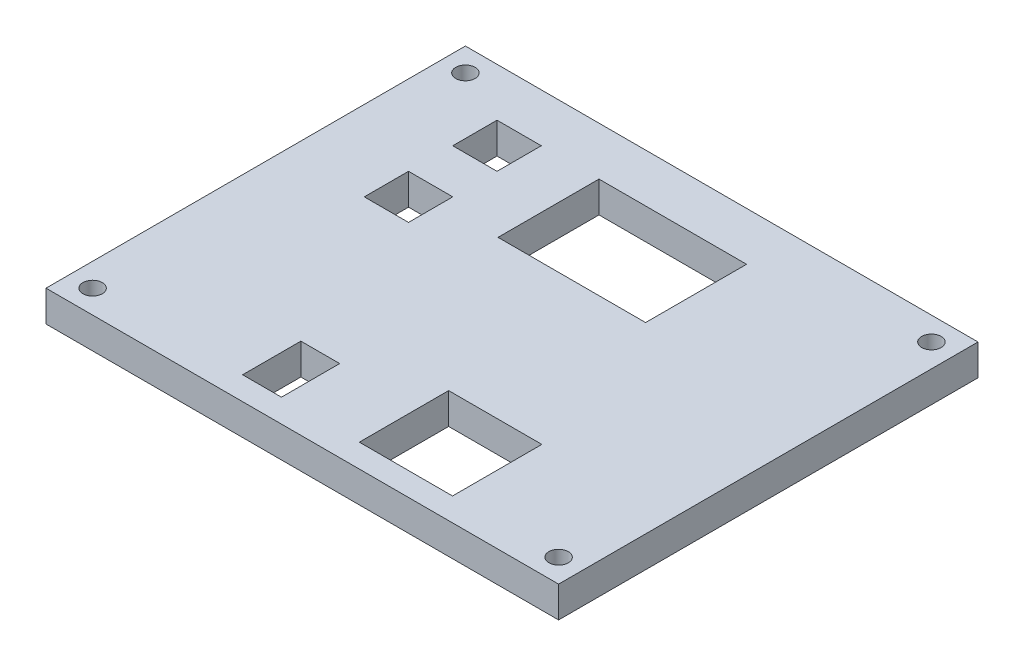
ISO-10303-21;
HEADER;
FILE_DESCRIPTION(('STEP AP214'),'2;1');
FILE_NAME('part.step','',(''),(''),'','','');
FILE_SCHEMA(('AUTOMOTIVE_DESIGN { 1 0 10303 214 1 1 1 1 }'));
ENDSEC;
DATA;
#1=APPLICATION_CONTEXT('core data for automotive mechanical design processes');
#2=APPLICATION_PROTOCOL_DEFINITION('international standard','automotive_design',2000,#1);
#3=PRODUCT_CONTEXT('',#1,'mechanical');
#4=PRODUCT('Part','Part','',(#3));
#5=PRODUCT_RELATED_PRODUCT_CATEGORY('part','',(#4));
#6=PRODUCT_DEFINITION_FORMATION('','',#4);
#7=PRODUCT_DEFINITION_CONTEXT('part definition',#1,'design');
#8=PRODUCT_DEFINITION('design','',#6,#7);
#9=PRODUCT_DEFINITION_SHAPE('','',#8);
#10=(LENGTH_UNIT() NAMED_UNIT(*) SI_UNIT(.MILLI.,.METRE.));
#11=(NAMED_UNIT(*) PLANE_ANGLE_UNIT() SI_UNIT($,.RADIAN.));
#12=(NAMED_UNIT(*) SI_UNIT($,.STERADIAN.) SOLID_ANGLE_UNIT());
#13=UNCERTAINTY_MEASURE_WITH_UNIT(LENGTH_MEASURE(1.E-05),#10,'distance_accuracy_value','');
#14=(GEOMETRIC_REPRESENTATION_CONTEXT(3) GLOBAL_UNCERTAINTY_ASSIGNED_CONTEXT((#13)) GLOBAL_UNIT_ASSIGNED_CONTEXT((#10,
#11,#12)) REPRESENTATION_CONTEXT('',''));
#15=CARTESIAN_POINT('',(0.,0.,0.));
#16=DIRECTION('',(0.,0.,1.));
#17=DIRECTION('',(1.,0.,0.));
#18=AXIS2_PLACEMENT_3D('',#15,#16,#17);
#19=CARTESIAN_POINT('',(0.,4.,0.));
#20=DIRECTION('',(1.,0.,0.));
#21=DIRECTION('',(0.,0.,-1.));
#22=AXIS2_PLACEMENT_3D('',#19,#20,#21);
#23=PLANE('',#22);
#24=DIRECTION('',(0.,0.,1.));
#25=VECTOR('',#24,1.);
#26=CARTESIAN_POINT('',(0.,0.,0.));
#27=LINE('',#26,#25);
#28=CARTESIAN_POINT('',(0.,0.,0.));
#29=VERTEX_POINT('',#28);
#30=CARTESIAN_POINT('',(0.,0.,54.));
#31=VERTEX_POINT('',#30);
#32=EDGE_CURVE('E462',#29,#31,#27,.T.);
#33=ORIENTED_EDGE('',*,*,#32,.T.);
#34=DIRECTION('',(0.,-1.,0.));
#35=VECTOR('',#34,1.);
#36=CARTESIAN_POINT('',(0.,4.,54.));
#37=LINE('',#36,#35);
#38=CARTESIAN_POINT('',(0.,4.,54.));
#39=VERTEX_POINT('',#38);
#40=EDGE_CURVE('E11',#39,#31,#37,.T.);
#41=ORIENTED_EDGE('',*,*,#40,.F.);
#42=DIRECTION('',(0.,0.,1.));
#43=VECTOR('',#42,1.);
#44=CARTESIAN_POINT('',(0.,4.,0.));
#45=LINE('',#44,#43);
#46=CARTESIAN_POINT('',(0.,4.,0.));
#47=VERTEX_POINT('',#46);
#48=EDGE_CURVE('E463',#47,#39,#45,.T.);
#49=ORIENTED_EDGE('',*,*,#48,.F.);
#50=DIRECTION('',(0.,-1.,0.));
#51=VECTOR('',#50,1.);
#52=CARTESIAN_POINT('',(0.,4.,0.));
#53=LINE('',#52,#51);
#54=EDGE_CURVE('E479',#47,#29,#53,.T.);
#55=ORIENTED_EDGE('',*,*,#54,.T.);
#56=EDGE_LOOP('',(#33,#41,#49,#55));
#57=FACE_BOUND('',#56,.T.);
#58=ADVANCED_FACE('F42',(#57),#23,.F.);
#59=CARTESIAN_POINT('',(0.,4.,54.));
#60=DIRECTION('',(0.,0.,-1.));
#61=DIRECTION('',(-1.,0.,0.));
#62=AXIS2_PLACEMENT_3D('',#59,#60,#61);
#63=PLANE('',#62);
#64=DIRECTION('',(1.,0.,0.));
#65=VECTOR('',#64,1.);
#66=CARTESIAN_POINT('',(0.,0.,54.));
#67=LINE('',#66,#65);
#68=CARTESIAN_POINT('',(66.,0.,54.));
#69=VERTEX_POINT('',#68);
#70=EDGE_CURVE('E483',#31,#69,#67,.T.);
#71=ORIENTED_EDGE('',*,*,#70,.T.);
#72=DIRECTION('',(0.,-1.,0.));
#73=VECTOR('',#72,1.);
#74=CARTESIAN_POINT('',(66.,4.,54.));
#75=LINE('',#74,#73);
#76=CARTESIAN_POINT('',(66.,4.,54.));
#77=VERTEX_POINT('',#76);
#78=EDGE_CURVE('E50',#77,#69,#75,.T.);
#79=ORIENTED_EDGE('',*,*,#78,.F.);
#80=DIRECTION('',(1.,0.,0.));
#81=VECTOR('',#80,1.);
#82=CARTESIAN_POINT('',(0.,4.,54.));
#83=LINE('',#82,#81);
#84=EDGE_CURVE('E467',#39,#77,#83,.T.);
#85=ORIENTED_EDGE('',*,*,#84,.F.);
#86=ORIENTED_EDGE('',*,*,#40,.T.);
#87=EDGE_LOOP('',(#71,#79,#85,#86));
#88=FACE_BOUND('',#87,.T.);
#89=ADVANCED_FACE('F505',(#88),#63,.F.);
#90=CARTESIAN_POINT('',(66.,4.,0.));
#91=DIRECTION('',(1.,0.,0.));
#92=DIRECTION('',(0.,0.,-1.));
#93=AXIS2_PLACEMENT_3D('',#90,#91,#92);
#94=PLANE('',#93);
#95=DIRECTION('',(0.,0.,1.));
#96=VECTOR('',#95,1.);
#97=CARTESIAN_POINT('',(66.,0.,0.));
#98=LINE('',#97,#96);
#99=CARTESIAN_POINT('',(66.,0.,0.));
#100=VERTEX_POINT('',#99);
#101=EDGE_CURVE('E487',#100,#69,#98,.T.);
#102=ORIENTED_EDGE('',*,*,#101,.F.);
#103=DIRECTION('',(0.,-1.,0.));
#104=VECTOR('',#103,1.);
#105=CARTESIAN_POINT('',(66.,4.,0.));
#106=LINE('',#105,#104);
#107=CARTESIAN_POINT('',(66.,4.,0.));
#108=VERTEX_POINT('',#107);
#109=EDGE_CURVE('E496',#108,#100,#106,.T.);
#110=ORIENTED_EDGE('',*,*,#109,.F.);
#111=DIRECTION('',(0.,0.,1.));
#112=VECTOR('',#111,1.);
#113=CARTESIAN_POINT('',(66.,4.,0.));
#114=LINE('',#113,#112);
#115=EDGE_CURVE('E471',#108,#77,#114,.T.);
#116=ORIENTED_EDGE('',*,*,#115,.T.);
#117=ORIENTED_EDGE('',*,*,#78,.T.);
#118=EDGE_LOOP('',(#102,#110,#116,#117));
#119=FACE_BOUND('',#118,.T.);
#120=ADVANCED_FACE('F502',(#119),#94,.T.);
#121=CARTESIAN_POINT('',(0.,4.,0.));
#122=DIRECTION('',(0.,0.,-1.));
#123=DIRECTION('',(-1.,0.,0.));
#124=AXIS2_PLACEMENT_3D('',#121,#122,#123);
#125=PLANE('',#124);
#126=DIRECTION('',(1.,0.,0.));
#127=VECTOR('',#126,1.);
#128=CARTESIAN_POINT('',(0.,0.,0.));
#129=LINE('',#128,#127);
#130=EDGE_CURVE('E468',#29,#100,#129,.T.);
#131=ORIENTED_EDGE('',*,*,#130,.F.);
#132=ORIENTED_EDGE('',*,*,#54,.F.);
#133=DIRECTION('',(1.,0.,0.));
#134=VECTOR('',#133,1.);
#135=CARTESIAN_POINT('',(0.,4.,0.));
#136=LINE('',#135,#134);
#137=EDGE_CURVE('E475',#47,#108,#136,.T.);
#138=ORIENTED_EDGE('',*,*,#137,.T.);
#139=ORIENTED_EDGE('',*,*,#109,.T.);
#140=EDGE_LOOP('',(#131,#132,#138,#139));
#141=FACE_BOUND('',#140,.T.);
#142=ADVANCED_FACE('F511',(#141),#125,.T.);
#143=CARTESIAN_POINT('',(0.,4.,0.));
#144=DIRECTION('',(0.,1.,0.));
#145=DIRECTION('',(0.,0.,1.));
#146=AXIS2_PLACEMENT_3D('',#143,#144,#145);
#147=PLANE('',#146);
#148=DIRECTION('',(0.,0.,1.));
#149=VECTOR('',#148,1.);
#150=CARTESIAN_POINT('',(37.3428467723542,4.,39.5));
#151=LINE('',#150,#149);
#152=CARTESIAN_POINT('',(37.3428467723542,4.,39.5));
#153=VERTEX_POINT('',#152);
#154=CARTESIAN_POINT('',(37.3428467723542,4.,51.));
#155=VERTEX_POINT('',#154);
#156=EDGE_CURVE('E57',#153,#155,#151,.T.);
#157=ORIENTED_EDGE('',*,*,#156,.F.);
#158=DIRECTION('',(-1.,0.,0.));
#159=VECTOR('',#158,1.);
#160=CARTESIAN_POINT('',(37.3428467723542,4.,39.5));
#161=LINE('',#160,#159);
#162=CARTESIAN_POINT('',(49.3428467723542,4.,39.5));
#163=VERTEX_POINT('',#162);
#164=EDGE_CURVE('E351',#163,#153,#161,.T.);
#165=ORIENTED_EDGE('',*,*,#164,.F.);
#166=DIRECTION('',(0.,0.,-1.));
#167=VECTOR('',#166,1.);
#168=CARTESIAN_POINT('',(49.3428467723542,4.,39.5));
#169=LINE('',#168,#167);
#170=CARTESIAN_POINT('',(49.3428467723542,4.,51.));
#171=VERTEX_POINT('',#170);
#172=EDGE_CURVE('E370',#171,#163,#169,.T.);
#173=ORIENTED_EDGE('',*,*,#172,.F.);
#174=DIRECTION('',(1.,0.,0.));
#175=VECTOR('',#174,1.);
#176=CARTESIAN_POINT('',(37.3428467723542,4.,51.));
#177=LINE('',#176,#175);
#178=EDGE_CURVE('E366',#155,#171,#177,.T.);
#179=ORIENTED_EDGE('',*,*,#178,.F.);
#180=EDGE_LOOP('',(#157,#165,#173,#179));
#181=FACE_BOUND('',#180,.T.);
#182=DIRECTION('',(0.,0.,1.));
#183=VECTOR('',#182,1.);
#184=CARTESIAN_POINT('',(23.4359550561798,4.,6.23462530139378));
#185=LINE('',#184,#183);
#186=CARTESIAN_POINT('',(23.4359550561798,4.,6.23462530139378));
#187=VERTEX_POINT('',#186);
#188=CARTESIAN_POINT('',(23.4359550561798,4.,19.2346253013938));
#189=VERTEX_POINT('',#188);
#190=EDGE_CURVE('E65',#187,#189,#185,.T.);
#191=ORIENTED_EDGE('',*,*,#190,.F.);
#192=DIRECTION('',(-1.,0.,0.));
#193=VECTOR('',#192,1.);
#194=CARTESIAN_POINT('',(23.4359550561798,4.,6.23462530139378));
#195=LINE('',#194,#193);
#196=CARTESIAN_POINT('',(42.4359550561798,4.,6.23462530139378));
#197=VERTEX_POINT('',#196);
#198=EDGE_CURVE('E309',#197,#187,#195,.T.);
#199=ORIENTED_EDGE('',*,*,#198,.F.);
#200=DIRECTION('',(0.,0.,-1.));
#201=VECTOR('',#200,1.);
#202=CARTESIAN_POINT('',(42.4359550561798,4.,6.23462530139378));
#203=LINE('',#202,#201);
#204=CARTESIAN_POINT('',(42.4359550561798,4.,19.2346253013938));
#205=VERTEX_POINT('',#204);
#206=EDGE_CURVE('E329',#205,#197,#203,.T.);
#207=ORIENTED_EDGE('',*,*,#206,.F.);
#208=DIRECTION('',(1.,0.,0.));
#209=VECTOR('',#208,1.);
#210=CARTESIAN_POINT('',(23.4359550561798,4.,19.2346253013938));
#211=LINE('',#210,#209);
#212=EDGE_CURVE('E324',#189,#205,#211,.T.);
#213=ORIENTED_EDGE('',*,*,#212,.F.);
#214=EDGE_LOOP('',(#191,#199,#207,#213));
#215=FACE_BOUND('',#214,.T.);
#216=DIRECTION('',(0.,0.,1.));
#217=VECTOR('',#216,1.);
#218=CARTESIAN_POINT('',(10.3072222462533,4.,6.23462530139378));
#219=LINE('',#218,#217);
#220=CARTESIAN_POINT('',(10.3072222462533,4.,6.23462530139378));
#221=VERTEX_POINT('',#220);
#222=CARTESIAN_POINT('',(10.3072222462533,4.,11.9346253013938));
#223=VERTEX_POINT('',#222);
#224=EDGE_CURVE('E278',#221,#223,#219,.T.);
#225=ORIENTED_EDGE('',*,*,#224,.F.);
#226=DIRECTION('',(-1.,0.,0.));
#227=VECTOR('',#226,1.);
#228=CARTESIAN_POINT('',(10.3072222462533,4.,6.23462530139378));
#229=LINE('',#228,#227);
#230=CARTESIAN_POINT('',(16.0072222462533,4.,6.23462530139378));
#231=VERTEX_POINT('',#230);
#232=EDGE_CURVE('E265',#231,#221,#229,.T.);
#233=ORIENTED_EDGE('',*,*,#232,.F.);
#234=DIRECTION('',(0.,0.,-1.));
#235=VECTOR('',#234,1.);
#236=CARTESIAN_POINT('',(16.0072222462533,4.,6.23462530139378));
#237=LINE('',#236,#235);
#238=CARTESIAN_POINT('',(16.0072222462533,4.,11.9346253013938));
#239=VERTEX_POINT('',#238);
#240=EDGE_CURVE('E286',#239,#231,#237,.T.);
#241=ORIENTED_EDGE('',*,*,#240,.F.);
#242=DIRECTION('',(1.,0.,0.));
#243=VECTOR('',#242,1.);
#244=CARTESIAN_POINT('',(10.3072222462533,4.,11.9346253013938));
#245=LINE('',#244,#243);
#246=EDGE_CURVE('E281',#223,#239,#245,.T.);
#247=ORIENTED_EDGE('',*,*,#246,.F.);
#248=EDGE_LOOP('',(#225,#233,#241,#247));
#249=FACE_BOUND('',#248,.T.);
#250=DIRECTION('',(0.,0.,1.));
#251=VECTOR('',#250,1.);
#252=CARTESIAN_POINT('',(10.3072222462533,4.,17.6307104987617));
#253=LINE('',#252,#251);
#254=CARTESIAN_POINT('',(10.3072222462533,4.,17.6307104987617));
#255=VERTEX_POINT('',#254);
#256=CARTESIAN_POINT('',(10.3072222462533,4.,23.3307104987617));
#257=VERTEX_POINT('',#256);
#258=EDGE_CURVE('E210',#255,#257,#253,.T.);
#259=ORIENTED_EDGE('',*,*,#258,.F.);
#260=DIRECTION('',(-1.,0.,0.));
#261=VECTOR('',#260,1.);
#262=CARTESIAN_POINT('',(10.3072222462533,4.,17.6307104987617));
#263=LINE('',#262,#261);
#264=CARTESIAN_POINT('',(16.0072222462531,4.,17.6307104987617));
#265=VERTEX_POINT('',#264);
#266=EDGE_CURVE('E231',#265,#255,#263,.T.);
#267=ORIENTED_EDGE('',*,*,#266,.F.);
#268=DIRECTION('',(0.,0.,-1.));
#269=VECTOR('',#268,1.);
#270=CARTESIAN_POINT('',(16.0072222462531,4.,17.6307104987617));
#271=LINE('',#270,#269);
#272=CARTESIAN_POINT('',(16.0072222462531,4.,23.3307104987617));
#273=VERTEX_POINT('',#272);
#274=EDGE_CURVE('E235',#273,#265,#271,.T.);
#275=ORIENTED_EDGE('',*,*,#274,.F.);
#276=DIRECTION('',(1.,0.,0.));
#277=VECTOR('',#276,1.);
#278=CARTESIAN_POINT('',(10.3072222462533,4.,23.3307104987617));
#279=LINE('',#278,#277);
#280=EDGE_CURVE('E244',#257,#273,#279,.T.);
#281=ORIENTED_EDGE('',*,*,#280,.F.);
#282=EDGE_LOOP('',(#259,#267,#275,#281));
#283=FACE_BOUND('',#282,.T.);
#284=DIRECTION('',(0.,0.,1.));
#285=VECTOR('',#284,1.);
#286=CARTESIAN_POINT('',(22.3150806727713,4.,43.5));
#287=LINE('',#286,#285);
#288=CARTESIAN_POINT('',(22.3150806727713,4.,43.5));
#289=VERTEX_POINT('',#288);
#290=CARTESIAN_POINT('',(22.3150806727713,4.,51.));
#291=VERTEX_POINT('',#290);
#292=EDGE_CURVE('E254',#289,#291,#287,.T.);
#293=ORIENTED_EDGE('',*,*,#292,.F.);
#294=DIRECTION('',(-1.,0.,0.));
#295=VECTOR('',#294,1.);
#296=CARTESIAN_POINT('',(22.3150806727713,4.,43.5));
#297=LINE('',#296,#295);
#298=CARTESIAN_POINT('',(27.3150806727713,4.,43.5));
#299=VERTEX_POINT('',#298);
#300=EDGE_CURVE('E392',#299,#289,#297,.T.);
#301=ORIENTED_EDGE('',*,*,#300,.F.);
#302=DIRECTION('',(0.,0.,-1.));
#303=VECTOR('',#302,1.);
#304=CARTESIAN_POINT('',(27.3150806727713,4.,43.5));
#305=LINE('',#304,#303);
#306=CARTESIAN_POINT('',(27.3150806727713,4.,51.));
#307=VERTEX_POINT('',#306);
#308=EDGE_CURVE('E411',#307,#299,#305,.T.);
#309=ORIENTED_EDGE('',*,*,#308,.F.);
#310=DIRECTION('',(1.,0.,0.));
#311=VECTOR('',#310,1.);
#312=CARTESIAN_POINT('',(22.3150806727713,4.,51.));
#313=LINE('',#312,#311);
#314=EDGE_CURVE('E407',#291,#307,#313,.T.);
#315=ORIENTED_EDGE('',*,*,#314,.F.);
#316=EDGE_LOOP('',(#293,#301,#309,#315));
#317=FACE_BOUND('',#316,.T.);
#318=CARTESIAN_POINT('',(3.00000000000001,4.,3.));
#319=DIRECTION('',(0.,1.,0.));
#320=DIRECTION('',(0.,0.,1.));
#321=AXIS2_PLACEMENT_3D('',#318,#319,#320);
#322=CIRCLE('',#321,1.24999999999999);
#323=CARTESIAN_POINT('',(3.00000000000001,4.,4.24999999999999));
#324=VERTEX_POINT('',#323);
#325=EDGE_CURVE('E421',#324,#324,#322,.T.);
#326=ORIENTED_EDGE('',*,*,#325,.F.);
#327=EDGE_LOOP('',(#326));
#328=FACE_BOUND('',#327,.T.);
#329=CARTESIAN_POINT('',(3.00000000000001,4.,51.));
#330=DIRECTION('',(0.,1.,0.));
#331=DIRECTION('',(0.,0.,1.));
#332=AXIS2_PLACEMENT_3D('',#329,#330,#331);
#333=CIRCLE('',#332,1.24999999999999);
#334=CARTESIAN_POINT('',(3.00000000000001,4.,52.25));
#335=VERTEX_POINT('',#334);
#336=EDGE_CURVE('E438',#335,#335,#333,.T.);
#337=ORIENTED_EDGE('',*,*,#336,.F.);
#338=EDGE_LOOP('',(#337));
#339=FACE_BOUND('',#338,.T.);
#340=CARTESIAN_POINT('',(63.,4.,51.));
#341=DIRECTION('',(0.,1.,0.));
#342=DIRECTION('',(0.,0.,1.));
#343=AXIS2_PLACEMENT_3D('',#340,#341,#342);
#344=CIRCLE('',#343,1.24999999999999);
#345=CARTESIAN_POINT('',(63.,4.,52.25));
#346=VERTEX_POINT('',#345);
#347=EDGE_CURVE('E446',#346,#346,#344,.T.);
#348=ORIENTED_EDGE('',*,*,#347,.F.);
#349=EDGE_LOOP('',(#348));
#350=FACE_BOUND('',#349,.T.);
#351=CARTESIAN_POINT('',(63.,4.,3.));
#352=DIRECTION('',(0.,1.,0.));
#353=DIRECTION('',(0.,0.,1.));
#354=AXIS2_PLACEMENT_3D('',#351,#352,#353);
#355=CIRCLE('',#354,1.24999999999999);
#356=CARTESIAN_POINT('',(63.,4.,4.24999999999998));
#357=VERTEX_POINT('',#356);
#358=EDGE_CURVE('E454',#357,#357,#355,.T.);
#359=ORIENTED_EDGE('',*,*,#358,.F.);
#360=EDGE_LOOP('',(#359));
#361=FACE_BOUND('',#360,.T.);
#362=ORIENTED_EDGE('',*,*,#48,.T.);
#363=ORIENTED_EDGE('',*,*,#84,.T.);
#364=ORIENTED_EDGE('',*,*,#115,.F.);
#365=ORIENTED_EDGE('',*,*,#137,.F.);
#366=EDGE_LOOP('',(#362,#363,#364,#365));
#367=FACE_BOUND('',#366,.T.);
#368=ADVANCED_FACE('F515',(#181,#215,#249,#283,#317,#328,#339,#350,#361,#367),#147,.T.);
#369=CARTESIAN_POINT('',(0.,0.,0.));
#370=DIRECTION('',(0.,1.,0.));
#371=DIRECTION('',(0.,0.,1.));
#372=AXIS2_PLACEMENT_3D('',#369,#370,#371);
#373=PLANE('',#372);
#374=DIRECTION('',(-1.,0.,0.));
#375=VECTOR('',#374,1.);
#376=CARTESIAN_POINT('',(37.3428467723542,0.,39.5));
#377=LINE('',#376,#375);
#378=CARTESIAN_POINT('',(49.3428467723542,0.,39.5));
#379=VERTEX_POINT('',#378);
#380=CARTESIAN_POINT('',(37.3428467723542,0.,39.5));
#381=VERTEX_POINT('',#380);
#382=EDGE_CURVE('E359',#379,#381,#377,.T.);
#383=ORIENTED_EDGE('',*,*,#382,.T.);
#384=DIRECTION('',(0.,0.,1.));
#385=VECTOR('',#384,1.);
#386=CARTESIAN_POINT('',(37.3428467723542,0.,39.5));
#387=LINE('',#386,#385);
#388=CARTESIAN_POINT('',(37.3428467723542,0.,51.));
#389=VERTEX_POINT('',#388);
#390=EDGE_CURVE('E346',#381,#389,#387,.T.);
#391=ORIENTED_EDGE('',*,*,#390,.T.);
#392=DIRECTION('',(1.,0.,0.));
#393=VECTOR('',#392,1.);
#394=CARTESIAN_POINT('',(37.3428467723542,0.,51.));
#395=LINE('',#394,#393);
#396=CARTESIAN_POINT('',(49.3428467723542,0.,51.));
#397=VERTEX_POINT('',#396);
#398=EDGE_CURVE('E350',#389,#397,#395,.T.);
#399=ORIENTED_EDGE('',*,*,#398,.T.);
#400=DIRECTION('',(0.,0.,-1.));
#401=VECTOR('',#400,1.);
#402=CARTESIAN_POINT('',(49.3428467723542,0.,39.5));
#403=LINE('',#402,#401);
#404=EDGE_CURVE('E355',#397,#379,#403,.T.);
#405=ORIENTED_EDGE('',*,*,#404,.T.);
#406=EDGE_LOOP('',(#383,#391,#399,#405));
#407=FACE_BOUND('',#406,.T.);
#408=DIRECTION('',(-1.,0.,0.));
#409=VECTOR('',#408,1.);
#410=CARTESIAN_POINT('',(23.4359550561798,0.,6.23462530139378));
#411=LINE('',#410,#409);
#412=CARTESIAN_POINT('',(42.4359550561798,0.,6.23462530139378));
#413=VERTEX_POINT('',#412);
#414=CARTESIAN_POINT('',(23.4359550561798,0.,6.23462530139378));
#415=VERTEX_POINT('',#414);
#416=EDGE_CURVE('E317',#413,#415,#411,.T.);
#417=ORIENTED_EDGE('',*,*,#416,.T.);
#418=DIRECTION('',(0.,0.,1.));
#419=VECTOR('',#418,1.);
#420=CARTESIAN_POINT('',(23.4359550561798,0.,6.23462530139378));
#421=LINE('',#420,#419);
#422=CARTESIAN_POINT('',(23.4359550561798,0.,19.2346253013938));
#423=VERTEX_POINT('',#422);
#424=EDGE_CURVE('E304',#415,#423,#421,.T.);
#425=ORIENTED_EDGE('',*,*,#424,.T.);
#426=DIRECTION('',(1.,0.,0.));
#427=VECTOR('',#426,1.);
#428=CARTESIAN_POINT('',(23.4359550561798,0.,19.2346253013938));
#429=LINE('',#428,#427);
#430=CARTESIAN_POINT('',(42.4359550561798,0.,19.2346253013938));
#431=VERTEX_POINT('',#430);
#432=EDGE_CURVE('E308',#423,#431,#429,.T.);
#433=ORIENTED_EDGE('',*,*,#432,.T.);
#434=DIRECTION('',(0.,0.,-1.));
#435=VECTOR('',#434,1.);
#436=CARTESIAN_POINT('',(42.4359550561798,0.,6.23462530139378));
#437=LINE('',#436,#435);
#438=EDGE_CURVE('E313',#431,#413,#437,.T.);
#439=ORIENTED_EDGE('',*,*,#438,.T.);
#440=EDGE_LOOP('',(#417,#425,#433,#439));
#441=FACE_BOUND('',#440,.T.);
#442=DIRECTION('',(-1.,0.,0.));
#443=VECTOR('',#442,1.);
#444=CARTESIAN_POINT('',(10.3072222462533,0.,6.23462530139378));
#445=LINE('',#444,#443);
#446=CARTESIAN_POINT('',(16.0072222462533,0.,6.23462530139378));
#447=VERTEX_POINT('',#446);
#448=CARTESIAN_POINT('',(10.3072222462533,0.,6.23462530139378));
#449=VERTEX_POINT('',#448);
#450=EDGE_CURVE('E273',#447,#449,#445,.T.);
#451=ORIENTED_EDGE('',*,*,#450,.T.);
#452=DIRECTION('',(0.,0.,1.));
#453=VECTOR('',#452,1.);
#454=CARTESIAN_POINT('',(10.3072222462533,0.,6.23462530139378));
#455=LINE('',#454,#453);
#456=CARTESIAN_POINT('',(10.3072222462533,0.,11.9346253013938));
#457=VERTEX_POINT('',#456);
#458=EDGE_CURVE('E260',#449,#457,#455,.T.);
#459=ORIENTED_EDGE('',*,*,#458,.T.);
#460=DIRECTION('',(1.,0.,0.));
#461=VECTOR('',#460,1.);
#462=CARTESIAN_POINT('',(10.3072222462533,0.,11.9346253013938));
#463=LINE('',#462,#461);
#464=CARTESIAN_POINT('',(16.0072222462533,0.,11.9346253013938));
#465=VERTEX_POINT('',#464);
#466=EDGE_CURVE('E264',#457,#465,#463,.T.);
#467=ORIENTED_EDGE('',*,*,#466,.T.);
#468=DIRECTION('',(0.,0.,-1.));
#469=VECTOR('',#468,1.);
#470=CARTESIAN_POINT('',(16.0072222462533,0.,6.23462530139378));
#471=LINE('',#470,#469);
#472=EDGE_CURVE('E269',#465,#447,#471,.T.);
#473=ORIENTED_EDGE('',*,*,#472,.T.);
#474=EDGE_LOOP('',(#451,#459,#467,#473));
#475=FACE_BOUND('',#474,.T.);
#476=DIRECTION('',(-1.,0.,0.));
#477=VECTOR('',#476,1.);
#478=CARTESIAN_POINT('',(10.3072222462533,0.,17.6307104987617));
#479=LINE('',#478,#477);
#480=CARTESIAN_POINT('',(16.0072222462531,0.,17.6307104987617));
#481=VERTEX_POINT('',#480);
#482=CARTESIAN_POINT('',(10.3072222462533,0.,17.6307104987617));
#483=VERTEX_POINT('',#482);
#484=EDGE_CURVE('E216',#481,#483,#479,.T.);
#485=ORIENTED_EDGE('',*,*,#484,.T.);
#486=DIRECTION('',(0.,0.,1.));
#487=VECTOR('',#486,1.);
#488=CARTESIAN_POINT('',(10.3072222462533,0.,17.6307104987617));
#489=LINE('',#488,#487);
#490=CARTESIAN_POINT('',(10.3072222462533,0.,23.3307104987617));
#491=VERTEX_POINT('',#490);
#492=EDGE_CURVE('E207',#483,#491,#489,.T.);
#493=ORIENTED_EDGE('',*,*,#492,.T.);
#494=DIRECTION('',(1.,0.,0.));
#495=VECTOR('',#494,1.);
#496=CARTESIAN_POINT('',(10.3072222462533,0.,23.3307104987617));
#497=LINE('',#496,#495);
#498=CARTESIAN_POINT('',(16.0072222462531,0.,23.3307104987617));
#499=VERTEX_POINT('',#498);
#500=EDGE_CURVE('E220',#491,#499,#497,.T.);
#501=ORIENTED_EDGE('',*,*,#500,.T.);
#502=DIRECTION('',(0.,0.,-1.));
#503=VECTOR('',#502,1.);
#504=CARTESIAN_POINT('',(16.0072222462531,0.,17.6307104987617));
#505=LINE('',#504,#503);
#506=EDGE_CURVE('E225',#499,#481,#505,.T.);
#507=ORIENTED_EDGE('',*,*,#506,.T.);
#508=EDGE_LOOP('',(#485,#493,#501,#507));
#509=FACE_BOUND('',#508,.T.);
#510=DIRECTION('',(-1.,0.,0.));
#511=VECTOR('',#510,1.);
#512=CARTESIAN_POINT('',(22.3150806727713,0.,43.5));
#513=LINE('',#512,#511);
#514=CARTESIAN_POINT('',(27.3150806727713,0.,43.5));
#515=VERTEX_POINT('',#514);
#516=CARTESIAN_POINT('',(22.3150806727713,0.,43.5));
#517=VERTEX_POINT('',#516);
#518=EDGE_CURVE('E400',#515,#517,#513,.T.);
#519=ORIENTED_EDGE('',*,*,#518,.T.);
#520=DIRECTION('',(0.,0.,1.));
#521=VECTOR('',#520,1.);
#522=CARTESIAN_POINT('',(22.3150806727713,0.,43.5));
#523=LINE('',#522,#521);
#524=CARTESIAN_POINT('',(22.3150806727713,0.,51.));
#525=VERTEX_POINT('',#524);
#526=EDGE_CURVE('E387',#517,#525,#523,.T.);
#527=ORIENTED_EDGE('',*,*,#526,.T.);
#528=DIRECTION('',(1.,0.,0.));
#529=VECTOR('',#528,1.);
#530=CARTESIAN_POINT('',(22.3150806727713,0.,51.));
#531=LINE('',#530,#529);
#532=CARTESIAN_POINT('',(27.3150806727713,0.,51.));
#533=VERTEX_POINT('',#532);
#534=EDGE_CURVE('E391',#525,#533,#531,.T.);
#535=ORIENTED_EDGE('',*,*,#534,.T.);
#536=DIRECTION('',(0.,0.,-1.));
#537=VECTOR('',#536,1.);
#538=CARTESIAN_POINT('',(27.3150806727713,0.,43.5));
#539=LINE('',#538,#537);
#540=EDGE_CURVE('E396',#533,#515,#539,.T.);
#541=ORIENTED_EDGE('',*,*,#540,.T.);
#542=EDGE_LOOP('',(#519,#527,#535,#541));
#543=FACE_BOUND('',#542,.T.);
#544=CARTESIAN_POINT('',(3.00000000000001,0.,3.));
#545=DIRECTION('',(0.,1.,0.));
#546=DIRECTION('',(0.,0.,1.));
#547=AXIS2_PLACEMENT_3D('',#544,#545,#546);
#548=CIRCLE('',#547,1.24999999999999);
#549=CARTESIAN_POINT('',(3.00000000000001,0.,4.25));
#550=VERTEX_POINT('',#549);
#551=EDGE_CURVE('E434',#550,#550,#548,.T.);
#552=ORIENTED_EDGE('',*,*,#551,.T.);
#553=EDGE_LOOP('',(#552));
#554=FACE_BOUND('',#553,.T.);
#555=CARTESIAN_POINT('',(3.00000000000001,0.,51.));
#556=DIRECTION('',(0.,1.,0.));
#557=DIRECTION('',(0.,0.,1.));
#558=AXIS2_PLACEMENT_3D('',#555,#556,#557);
#559=CIRCLE('',#558,1.24999999999999);
#560=CARTESIAN_POINT('',(3.00000000000001,0.,52.25));
#561=VERTEX_POINT('',#560);
#562=EDGE_CURVE('E442',#561,#561,#559,.T.);
#563=ORIENTED_EDGE('',*,*,#562,.T.);
#564=EDGE_LOOP('',(#563));
#565=FACE_BOUND('',#564,.T.);
#566=CARTESIAN_POINT('',(63.,0.,51.));
#567=DIRECTION('',(0.,1.,0.));
#568=DIRECTION('',(0.,0.,1.));
#569=AXIS2_PLACEMENT_3D('',#566,#567,#568);
#570=CIRCLE('',#569,1.24999999999999);
#571=CARTESIAN_POINT('',(63.,0.,52.25));
#572=VERTEX_POINT('',#571);
#573=EDGE_CURVE('E450',#572,#572,#570,.T.);
#574=ORIENTED_EDGE('',*,*,#573,.T.);
#575=EDGE_LOOP('',(#574));
#576=FACE_BOUND('',#575,.T.);
#577=CARTESIAN_POINT('',(63.,0.,3.));
#578=DIRECTION('',(0.,1.,0.));
#579=DIRECTION('',(0.,0.,1.));
#580=AXIS2_PLACEMENT_3D('',#577,#578,#579);
#581=CIRCLE('',#580,1.24999999999999);
#582=CARTESIAN_POINT('',(63.,0.,4.24999999999999));
#583=VERTEX_POINT('',#582);
#584=EDGE_CURVE('E458',#583,#583,#581,.T.);
#585=ORIENTED_EDGE('',*,*,#584,.T.);
#586=EDGE_LOOP('',(#585));
#587=FACE_BOUND('',#586,.T.);
#588=ORIENTED_EDGE('',*,*,#32,.F.);
#589=ORIENTED_EDGE('',*,*,#130,.T.);
#590=ORIENTED_EDGE('',*,*,#101,.T.);
#591=ORIENTED_EDGE('',*,*,#70,.F.);
#592=EDGE_LOOP('',(#588,#589,#590,#591));
#593=FACE_BOUND('',#592,.T.);
#594=ADVANCED_FACE('F227',(#407,#441,#475,#509,#543,#554,#565,#576,#587,#593),#373,.F.);
#595=CARTESIAN_POINT('',(63.,4.,3.));
#596=DIRECTION('',(0.,1.,0.));
#597=DIRECTION('',(0.,0.,1.));
#598=AXIS2_PLACEMENT_3D('',#595,#596,#597);
#599=CYLINDRICAL_SURFACE('',#598,1.24999999999999);
#600=ORIENTED_EDGE('',*,*,#584,.F.);
#601=EDGE_LOOP('',(#600));
#602=FACE_BOUND('',#601,.T.);
#603=ORIENTED_EDGE('',*,*,#358,.T.);
#604=EDGE_LOOP('',(#603));
#605=FACE_BOUND('',#604,.T.);
#606=ADVANCED_FACE('F530',(#602,#605),#599,.F.);
#607=CARTESIAN_POINT('',(63.,4.,51.));
#608=DIRECTION('',(0.,1.,0.));
#609=DIRECTION('',(0.,0.,1.));
#610=AXIS2_PLACEMENT_3D('',#607,#608,#609);
#611=CYLINDRICAL_SURFACE('',#610,1.24999999999999);
#612=ORIENTED_EDGE('',*,*,#573,.F.);
#613=EDGE_LOOP('',(#612));
#614=FACE_BOUND('',#613,.T.);
#615=ORIENTED_EDGE('',*,*,#347,.T.);
#616=EDGE_LOOP('',(#615));
#617=FACE_BOUND('',#616,.T.);
#618=ADVANCED_FACE('F537',(#614,#617),#611,.F.);
#619=CARTESIAN_POINT('',(3.00000000000001,4.,51.));
#620=DIRECTION('',(0.,1.,0.));
#621=DIRECTION('',(0.,0.,1.));
#622=AXIS2_PLACEMENT_3D('',#619,#620,#621);
#623=CYLINDRICAL_SURFACE('',#622,1.24999999999999);
#624=ORIENTED_EDGE('',*,*,#562,.F.);
#625=EDGE_LOOP('',(#624));
#626=FACE_BOUND('',#625,.T.);
#627=ORIENTED_EDGE('',*,*,#336,.T.);
#628=EDGE_LOOP('',(#627));
#629=FACE_BOUND('',#628,.T.);
#630=ADVANCED_FACE('F541',(#626,#629),#623,.F.);
#631=CARTESIAN_POINT('',(3.00000000000001,4.,3.));
#632=DIRECTION('',(0.,1.,0.));
#633=DIRECTION('',(0.,0.,1.));
#634=AXIS2_PLACEMENT_3D('',#631,#632,#633);
#635=CYLINDRICAL_SURFACE('',#634,1.24999999999999);
#636=ORIENTED_EDGE('',*,*,#551,.F.);
#637=EDGE_LOOP('',(#636));
#638=FACE_BOUND('',#637,.T.);
#639=ORIENTED_EDGE('',*,*,#325,.T.);
#640=EDGE_LOOP('',(#639));
#641=FACE_BOUND('',#640,.T.);
#642=ADVANCED_FACE('F545',(#638,#641),#635,.F.);
#643=CARTESIAN_POINT('',(22.3150806727713,0.,43.5));
#644=DIRECTION('',(-1.,0.,0.));
#645=DIRECTION('',(0.,0.,1.));
#646=AXIS2_PLACEMENT_3D('',#643,#644,#645);
#647=PLANE('',#646);
#648=ORIENTED_EDGE('',*,*,#292,.T.);
#649=DIRECTION('',(0.,1.,0.));
#650=VECTOR('',#649,1.);
#651=CARTESIAN_POINT('',(22.3150806727713,0.,51.));
#652=LINE('',#651,#650);
#653=EDGE_CURVE('E404',#525,#291,#652,.T.);
#654=ORIENTED_EDGE('',*,*,#653,.F.);
#655=ORIENTED_EDGE('',*,*,#526,.F.);
#656=DIRECTION('',(0.,1.,0.));
#657=VECTOR('',#656,1.);
#658=CARTESIAN_POINT('',(22.3150806727713,0.,43.5));
#659=LINE('',#658,#657);
#660=EDGE_CURVE('E418',#517,#289,#659,.T.);
#661=ORIENTED_EDGE('',*,*,#660,.T.);
#662=EDGE_LOOP('',(#648,#654,#655,#661));
#663=FACE_BOUND('',#662,.T.);
#664=ADVANCED_FACE('F549',(#663),#647,.F.);
#665=CARTESIAN_POINT('',(22.3150806727713,0.,43.5));
#666=DIRECTION('',(0.,0.,-1.));
#667=DIRECTION('',(-1.,0.,0.));
#668=AXIS2_PLACEMENT_3D('',#665,#666,#667);
#669=PLANE('',#668);
#670=ORIENTED_EDGE('',*,*,#300,.T.);
#671=ORIENTED_EDGE('',*,*,#660,.F.);
#672=ORIENTED_EDGE('',*,*,#518,.F.);
#673=DIRECTION('',(0.,1.,0.));
#674=VECTOR('',#673,1.);
#675=CARTESIAN_POINT('',(27.3150806727713,0.,43.5));
#676=LINE('',#675,#674);
#677=EDGE_CURVE('E422',#515,#299,#676,.T.);
#678=ORIENTED_EDGE('',*,*,#677,.T.);
#679=EDGE_LOOP('',(#670,#671,#672,#678));
#680=FACE_BOUND('',#679,.T.);
#681=ADVANCED_FACE('F553',(#680),#669,.F.);
#682=CARTESIAN_POINT('',(27.3150806727713,0.,43.5));
#683=DIRECTION('',(1.,0.,0.));
#684=DIRECTION('',(0.,0.,-1.));
#685=AXIS2_PLACEMENT_3D('',#682,#683,#684);
#686=PLANE('',#685);
#687=ORIENTED_EDGE('',*,*,#308,.T.);
#688=ORIENTED_EDGE('',*,*,#677,.F.);
#689=ORIENTED_EDGE('',*,*,#540,.F.);
#690=DIRECTION('',(0.,1.,0.));
#691=VECTOR('',#690,1.);
#692=CARTESIAN_POINT('',(27.3150806727713,0.,51.));
#693=LINE('',#692,#691);
#694=EDGE_CURVE('E425',#533,#307,#693,.T.);
#695=ORIENTED_EDGE('',*,*,#694,.T.);
#696=EDGE_LOOP('',(#687,#688,#689,#695));
#697=FACE_BOUND('',#696,.T.);
#698=ADVANCED_FACE('F558',(#697),#686,.F.);
#699=CARTESIAN_POINT('',(22.3150806727713,0.,51.));
#700=DIRECTION('',(0.,0.,1.));
#701=DIRECTION('',(1.,0.,0.));
#702=AXIS2_PLACEMENT_3D('',#699,#700,#701);
#703=PLANE('',#702);
#704=ORIENTED_EDGE('',*,*,#314,.T.);
#705=ORIENTED_EDGE('',*,*,#694,.F.);
#706=ORIENTED_EDGE('',*,*,#534,.F.);
#707=ORIENTED_EDGE('',*,*,#653,.T.);
#708=EDGE_LOOP('',(#704,#705,#706,#707));
#709=FACE_BOUND('',#708,.T.);
#710=ADVANCED_FACE('F555',(#709),#703,.F.);
#711=CARTESIAN_POINT('',(10.3072222462533,0.,17.6307104987617));
#712=DIRECTION('',(-1.,0.,0.));
#713=DIRECTION('',(0.,0.,1.));
#714=AXIS2_PLACEMENT_3D('',#711,#712,#713);
#715=PLANE('',#714);
#716=ORIENTED_EDGE('',*,*,#258,.T.);
#717=DIRECTION('',(0.,1.,0.));
#718=VECTOR('',#717,1.);
#719=CARTESIAN_POINT('',(10.3072222462533,0.,23.3307104987617));
#720=LINE('',#719,#718);
#721=EDGE_CURVE('E203',#491,#257,#720,.T.);
#722=ORIENTED_EDGE('',*,*,#721,.F.);
#723=ORIENTED_EDGE('',*,*,#492,.F.);
#724=DIRECTION('',(0.,1.,0.));
#725=VECTOR('',#724,1.);
#726=CARTESIAN_POINT('',(10.3072222462533,0.,17.6307104987617));
#727=LINE('',#726,#725);
#728=EDGE_CURVE('E251',#483,#255,#727,.T.);
#729=ORIENTED_EDGE('',*,*,#728,.T.);
#730=EDGE_LOOP('',(#716,#722,#723,#729));
#731=FACE_BOUND('',#730,.T.);
#732=ADVANCED_FACE('F205',(#731),#715,.F.);
#733=CARTESIAN_POINT('',(10.3072222462533,0.,17.6307104987617));
#734=DIRECTION('',(0.,0.,-1.));
#735=DIRECTION('',(-1.,0.,0.));
#736=AXIS2_PLACEMENT_3D('',#733,#734,#735);
#737=PLANE('',#736);
#738=ORIENTED_EDGE('',*,*,#266,.T.);
#739=ORIENTED_EDGE('',*,*,#728,.F.);
#740=ORIENTED_EDGE('',*,*,#484,.F.);
#741=DIRECTION('',(0.,1.,0.));
#742=VECTOR('',#741,1.);
#743=CARTESIAN_POINT('',(16.0072222462531,0.,17.6307104987617));
#744=LINE('',#743,#742);
#745=EDGE_CURVE('E255',#481,#265,#744,.T.);
#746=ORIENTED_EDGE('',*,*,#745,.T.);
#747=EDGE_LOOP('',(#738,#739,#740,#746));
#748=FACE_BOUND('',#747,.T.);
#749=ADVANCED_FACE('F614',(#748),#737,.F.);
#750=CARTESIAN_POINT('',(16.0072222462531,0.,17.6307104987617));
#751=DIRECTION('',(1.,0.,0.));
#752=DIRECTION('',(0.,0.,-1.));
#753=AXIS2_PLACEMENT_3D('',#750,#751,#752);
#754=PLANE('',#753);
#755=ORIENTED_EDGE('',*,*,#274,.T.);
#756=ORIENTED_EDGE('',*,*,#745,.F.);
#757=ORIENTED_EDGE('',*,*,#506,.F.);
#758=DIRECTION('',(0.,1.,0.));
#759=VECTOR('',#758,1.);
#760=CARTESIAN_POINT('',(16.0072222462531,0.,23.3307104987617));
#761=LINE('',#760,#759);
#762=EDGE_CURVE('E215',#499,#273,#761,.T.);
#763=ORIENTED_EDGE('',*,*,#762,.T.);
#764=EDGE_LOOP('',(#755,#756,#757,#763));
#765=FACE_BOUND('',#764,.T.);
#766=ADVANCED_FACE('F617',(#765),#754,.F.);
#767=CARTESIAN_POINT('',(10.3072222462533,0.,23.3307104987617));
#768=DIRECTION('',(0.,0.,1.));
#769=DIRECTION('',(1.,0.,0.));
#770=AXIS2_PLACEMENT_3D('',#767,#768,#769);
#771=PLANE('',#770);
#772=ORIENTED_EDGE('',*,*,#280,.T.);
#773=ORIENTED_EDGE('',*,*,#762,.F.);
#774=ORIENTED_EDGE('',*,*,#500,.F.);
#775=ORIENTED_EDGE('',*,*,#721,.T.);
#776=EDGE_LOOP('',(#772,#773,#774,#775));
#777=FACE_BOUND('',#776,.T.);
#778=ADVANCED_FACE('F221',(#777),#771,.F.);
#779=CARTESIAN_POINT('',(10.3072222462533,0.,6.23462530139378));
#780=DIRECTION('',(-1.,0.,0.));
#781=DIRECTION('',(0.,0.,1.));
#782=AXIS2_PLACEMENT_3D('',#779,#780,#781);
#783=PLANE('',#782);
#784=ORIENTED_EDGE('',*,*,#224,.T.);
#785=DIRECTION('',(0.,1.,0.));
#786=VECTOR('',#785,1.);
#787=CARTESIAN_POINT('',(10.3072222462533,0.,11.9346253013938));
#788=LINE('',#787,#786);
#789=EDGE_CURVE('E277',#457,#223,#788,.T.);
#790=ORIENTED_EDGE('',*,*,#789,.F.);
#791=ORIENTED_EDGE('',*,*,#458,.F.);
#792=DIRECTION('',(0.,1.,0.));
#793=VECTOR('',#792,1.);
#794=CARTESIAN_POINT('',(10.3072222462533,0.,6.23462530139378));
#795=LINE('',#794,#793);
#796=EDGE_CURVE('E245',#449,#221,#795,.T.);
#797=ORIENTED_EDGE('',*,*,#796,.T.);
#798=EDGE_LOOP('',(#784,#790,#791,#797));
#799=FACE_BOUND('',#798,.T.);
#800=ADVANCED_FACE('F597',(#799),#783,.F.);
#801=CARTESIAN_POINT('',(10.3072222462533,0.,6.23462530139378));
#802=DIRECTION('',(0.,0.,-1.));
#803=DIRECTION('',(-1.,0.,0.));
#804=AXIS2_PLACEMENT_3D('',#801,#802,#803);
#805=PLANE('',#804);
#806=ORIENTED_EDGE('',*,*,#232,.T.);
#807=ORIENTED_EDGE('',*,*,#796,.F.);
#808=ORIENTED_EDGE('',*,*,#450,.F.);
#809=DIRECTION('',(0.,1.,0.));
#810=VECTOR('',#809,1.);
#811=CARTESIAN_POINT('',(16.0072222462533,0.,6.23462530139378));
#812=LINE('',#811,#810);
#813=EDGE_CURVE('E295',#447,#231,#812,.T.);
#814=ORIENTED_EDGE('',*,*,#813,.T.);
#815=EDGE_LOOP('',(#806,#807,#808,#814));
#816=FACE_BOUND('',#815,.T.);
#817=ADVANCED_FACE('F600',(#816),#805,.F.);
#818=CARTESIAN_POINT('',(16.0072222462533,0.,6.23462530139378));
#819=DIRECTION('',(1.,0.,0.));
#820=DIRECTION('',(0.,0.,-1.));
#821=AXIS2_PLACEMENT_3D('',#818,#819,#820);
#822=PLANE('',#821);
#823=ORIENTED_EDGE('',*,*,#240,.T.);
#824=ORIENTED_EDGE('',*,*,#813,.F.);
#825=ORIENTED_EDGE('',*,*,#472,.F.);
#826=DIRECTION('',(0.,1.,0.));
#827=VECTOR('',#826,1.);
#828=CARTESIAN_POINT('',(16.0072222462533,0.,11.9346253013938));
#829=LINE('',#828,#827);
#830=EDGE_CURVE('E298',#465,#239,#829,.T.);
#831=ORIENTED_EDGE('',*,*,#830,.T.);
#832=EDGE_LOOP('',(#823,#824,#825,#831));
#833=FACE_BOUND('',#832,.T.);
#834=ADVANCED_FACE('F604',(#833),#822,.F.);
#835=CARTESIAN_POINT('',(10.3072222462533,0.,11.9346253013938));
#836=DIRECTION('',(0.,0.,1.));
#837=DIRECTION('',(1.,0.,0.));
#838=AXIS2_PLACEMENT_3D('',#835,#836,#837);
#839=PLANE('',#838);
#840=ORIENTED_EDGE('',*,*,#246,.T.);
#841=ORIENTED_EDGE('',*,*,#830,.F.);
#842=ORIENTED_EDGE('',*,*,#466,.F.);
#843=ORIENTED_EDGE('',*,*,#789,.T.);
#844=EDGE_LOOP('',(#840,#841,#842,#843));
#845=FACE_BOUND('',#844,.T.);
#846=ADVANCED_FACE('F586',(#845),#839,.F.);
#847=CARTESIAN_POINT('',(23.4359550561798,0.,6.23462530139378));
#848=DIRECTION('',(-1.,0.,0.));
#849=DIRECTION('',(0.,0.,1.));
#850=AXIS2_PLACEMENT_3D('',#847,#848,#849);
#851=PLANE('',#850);
#852=ORIENTED_EDGE('',*,*,#190,.T.);
#853=DIRECTION('',(0.,1.,0.));
#854=VECTOR('',#853,1.);
#855=CARTESIAN_POINT('',(23.4359550561798,0.,19.2346253013938));
#856=LINE('',#855,#854);
#857=EDGE_CURVE('E321',#423,#189,#856,.T.);
#858=ORIENTED_EDGE('',*,*,#857,.F.);
#859=ORIENTED_EDGE('',*,*,#424,.F.);
#860=DIRECTION('',(0.,1.,0.));
#861=VECTOR('',#860,1.);
#862=CARTESIAN_POINT('',(23.4359550561798,0.,6.23462530139378));
#863=LINE('',#862,#861);
#864=EDGE_CURVE('E282',#415,#187,#863,.T.);
#865=ORIENTED_EDGE('',*,*,#864,.T.);
#866=EDGE_LOOP('',(#852,#858,#859,#865));
#867=FACE_BOUND('',#866,.T.);
#868=ADVANCED_FACE('F582',(#867),#851,.F.);
#869=CARTESIAN_POINT('',(23.4359550561798,0.,6.23462530139378));
#870=DIRECTION('',(0.,0.,-1.));
#871=DIRECTION('',(-1.,0.,0.));
#872=AXIS2_PLACEMENT_3D('',#869,#870,#871);
#873=PLANE('',#872);
#874=ORIENTED_EDGE('',*,*,#198,.T.);
#875=ORIENTED_EDGE('',*,*,#864,.F.);
#876=ORIENTED_EDGE('',*,*,#416,.F.);
#877=DIRECTION('',(0.,1.,0.));
#878=VECTOR('',#877,1.);
#879=CARTESIAN_POINT('',(42.4359550561798,0.,6.23462530139378));
#880=LINE('',#879,#878);
#881=EDGE_CURVE('E338',#413,#197,#880,.T.);
#882=ORIENTED_EDGE('',*,*,#881,.T.);
#883=EDGE_LOOP('',(#874,#875,#876,#882));
#884=FACE_BOUND('',#883,.T.);
#885=ADVANCED_FACE('F585',(#884),#873,.F.);
#886=CARTESIAN_POINT('',(42.4359550561798,0.,6.23462530139378));
#887=DIRECTION('',(1.,0.,0.));
#888=DIRECTION('',(0.,0.,-1.));
#889=AXIS2_PLACEMENT_3D('',#886,#887,#888);
#890=PLANE('',#889);
#891=ORIENTED_EDGE('',*,*,#206,.T.);
#892=ORIENTED_EDGE('',*,*,#881,.F.);
#893=ORIENTED_EDGE('',*,*,#438,.F.);
#894=DIRECTION('',(0.,1.,0.));
#895=VECTOR('',#894,1.);
#896=CARTESIAN_POINT('',(42.4359550561798,0.,19.2346253013938));
#897=LINE('',#896,#895);
#898=EDGE_CURVE('E341',#431,#205,#897,.T.);
#899=ORIENTED_EDGE('',*,*,#898,.T.);
#900=EDGE_LOOP('',(#891,#892,#893,#899));
#901=FACE_BOUND('',#900,.T.);
#902=ADVANCED_FACE('F589',(#901),#890,.F.);
#903=CARTESIAN_POINT('',(23.4359550561798,0.,19.2346253013938));
#904=DIRECTION('',(0.,0.,1.));
#905=DIRECTION('',(1.,0.,0.));
#906=AXIS2_PLACEMENT_3D('',#903,#904,#905);
#907=PLANE('',#906);
#908=ORIENTED_EDGE('',*,*,#212,.T.);
#909=ORIENTED_EDGE('',*,*,#898,.F.);
#910=ORIENTED_EDGE('',*,*,#432,.F.);
#911=ORIENTED_EDGE('',*,*,#857,.T.);
#912=EDGE_LOOP('',(#908,#909,#910,#911));
#913=FACE_BOUND('',#912,.T.);
#914=ADVANCED_FACE('F570',(#913),#907,.F.);
#915=CARTESIAN_POINT('',(37.3428467723542,0.,39.5));
#916=DIRECTION('',(-1.,0.,0.));
#917=DIRECTION('',(0.,0.,1.));
#918=AXIS2_PLACEMENT_3D('',#915,#916,#917);
#919=PLANE('',#918);
#920=ORIENTED_EDGE('',*,*,#156,.T.);
#921=DIRECTION('',(0.,1.,0.));
#922=VECTOR('',#921,1.);
#923=CARTESIAN_POINT('',(37.3428467723542,0.,51.));
#924=LINE('',#923,#922);
#925=EDGE_CURVE('E363',#389,#155,#924,.T.);
#926=ORIENTED_EDGE('',*,*,#925,.F.);
#927=ORIENTED_EDGE('',*,*,#390,.F.);
#928=DIRECTION('',(0.,1.,0.));
#929=VECTOR('',#928,1.);
#930=CARTESIAN_POINT('',(37.3428467723542,0.,39.5));
#931=LINE('',#930,#929);
#932=EDGE_CURVE('E325',#381,#153,#931,.T.);
#933=ORIENTED_EDGE('',*,*,#932,.T.);
#934=EDGE_LOOP('',(#920,#926,#927,#933));
#935=FACE_BOUND('',#934,.T.);
#936=ADVANCED_FACE('F566',(#935),#919,.F.);
#937=CARTESIAN_POINT('',(37.3428467723542,0.,39.5));
#938=DIRECTION('',(0.,0.,-1.));
#939=DIRECTION('',(-1.,0.,0.));
#940=AXIS2_PLACEMENT_3D('',#937,#938,#939);
#941=PLANE('',#940);
#942=ORIENTED_EDGE('',*,*,#164,.T.);
#943=ORIENTED_EDGE('',*,*,#932,.F.);
#944=ORIENTED_EDGE('',*,*,#382,.F.);
#945=DIRECTION('',(0.,1.,0.));
#946=VECTOR('',#945,1.);
#947=CARTESIAN_POINT('',(49.3428467723542,0.,39.5));
#948=LINE('',#947,#946);
#949=EDGE_CURVE('E379',#379,#163,#948,.T.);
#950=ORIENTED_EDGE('',*,*,#949,.T.);
#951=EDGE_LOOP('',(#942,#943,#944,#950));
#952=FACE_BOUND('',#951,.T.);
#953=ADVANCED_FACE('F569',(#952),#941,.F.);
#954=CARTESIAN_POINT('',(49.3428467723542,0.,39.5));
#955=DIRECTION('',(1.,0.,0.));
#956=DIRECTION('',(0.,0.,-1.));
#957=AXIS2_PLACEMENT_3D('',#954,#955,#956);
#958=PLANE('',#957);
#959=ORIENTED_EDGE('',*,*,#172,.T.);
#960=ORIENTED_EDGE('',*,*,#949,.F.);
#961=ORIENTED_EDGE('',*,*,#404,.F.);
#962=DIRECTION('',(0.,1.,0.));
#963=VECTOR('',#962,1.);
#964=CARTESIAN_POINT('',(49.3428467723542,0.,51.));
#965=LINE('',#964,#963);
#966=EDGE_CURVE('E382',#397,#171,#965,.T.);
#967=ORIENTED_EDGE('',*,*,#966,.T.);
#968=EDGE_LOOP('',(#959,#960,#961,#967));
#969=FACE_BOUND('',#968,.T.);
#970=ADVANCED_FACE('F574',(#969),#958,.F.);
#971=CARTESIAN_POINT('',(37.3428467723542,0.,51.));
#972=DIRECTION('',(0.,0.,1.));
#973=DIRECTION('',(1.,0.,0.));
#974=AXIS2_PLACEMENT_3D('',#971,#972,#973);
#975=PLANE('',#974);
#976=ORIENTED_EDGE('',*,*,#178,.T.);
#977=ORIENTED_EDGE('',*,*,#966,.F.);
#978=ORIENTED_EDGE('',*,*,#398,.F.);
#979=ORIENTED_EDGE('',*,*,#925,.T.);
#980=EDGE_LOOP('',(#976,#977,#978,#979));
#981=FACE_BOUND('',#980,.T.);
#982=ADVANCED_FACE('F571',(#981),#975,.F.);
#983=CLOSED_SHELL('',(#58,#89,#120,#142,#368,#594,#606,#618,#630,#642,#664,#681,#698,#710,#732,
#749,#766,#778,#800,#817,#834,#846,#868,#885,#902,#914,#936,#953,#970,#982));
#984=MANIFOLD_SOLID_BREP('B2',#983);
#985=ADVANCED_BREP_SHAPE_REPRESENTATION('',(#18,#984),#14);
#986=SHAPE_DEFINITION_REPRESENTATION(#9,#985);
ENDSEC;
END-ISO-10303-21;
